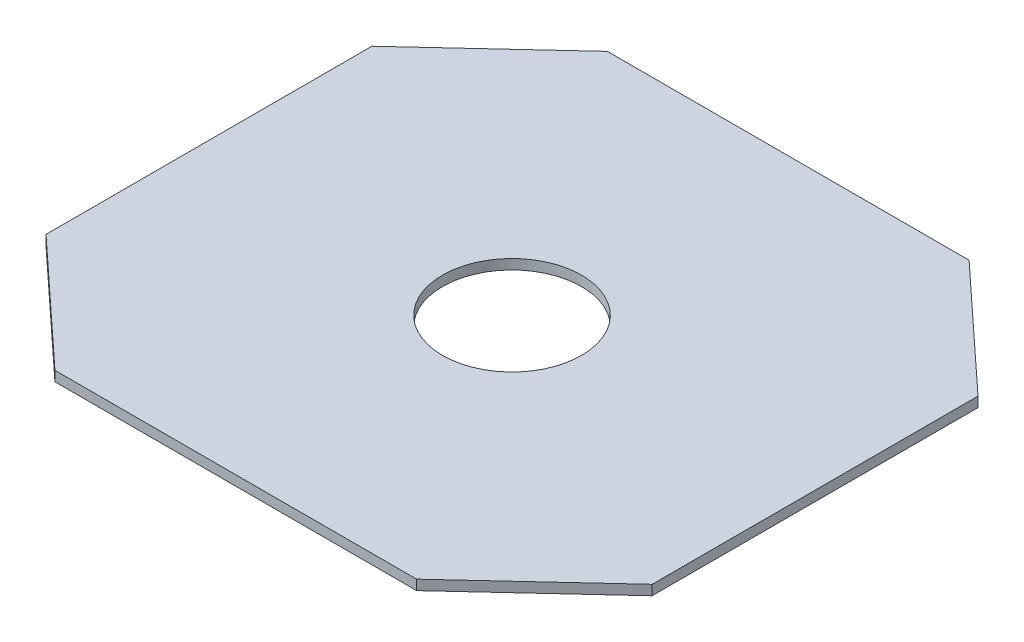
ISO-10303-21;
HEADER;
FILE_DESCRIPTION(('STEP AP214'),'2;1');
FILE_NAME('part.step','',(''),(''),'','','');
FILE_SCHEMA(('AUTOMOTIVE_DESIGN { 1 0 10303 214 1 1 1 1 }'));
ENDSEC;
DATA;
#1=APPLICATION_CONTEXT('core data for automotive mechanical design processes');
#2=APPLICATION_PROTOCOL_DEFINITION('international standard','automotive_design',2000,#1);
#3=PRODUCT_CONTEXT('',#1,'mechanical');
#4=PRODUCT('Part','Part','',(#3));
#5=PRODUCT_RELATED_PRODUCT_CATEGORY('part','',(#4));
#6=PRODUCT_DEFINITION_FORMATION('','',#4);
#7=PRODUCT_DEFINITION_CONTEXT('part definition',#1,'design');
#8=PRODUCT_DEFINITION('design','',#6,#7);
#9=PRODUCT_DEFINITION_SHAPE('','',#8);
#10=(LENGTH_UNIT() NAMED_UNIT(*) SI_UNIT(.MILLI.,.METRE.));
#11=(NAMED_UNIT(*) PLANE_ANGLE_UNIT() SI_UNIT($,.RADIAN.));
#12=(NAMED_UNIT(*) SI_UNIT($,.STERADIAN.) SOLID_ANGLE_UNIT());
#13=UNCERTAINTY_MEASURE_WITH_UNIT(LENGTH_MEASURE(1.E-05),#10,'distance_accuracy_value','');
#14=(GEOMETRIC_REPRESENTATION_CONTEXT(3) GLOBAL_UNCERTAINTY_ASSIGNED_CONTEXT((#13)) GLOBAL_UNIT_ASSIGNED_CONTEXT((#10,
#11,#12)) REPRESENTATION_CONTEXT('',''));
#15=CARTESIAN_POINT('',(0.,0.,0.));
#16=DIRECTION('',(0.,0.,1.));
#17=DIRECTION('',(1.,0.,0.));
#18=AXIS2_PLACEMENT_3D('',#15,#16,#17);
#19=CARTESIAN_POINT('',(0.80694849794305,5.,-219.257942140658));
#20=DIRECTION('',(0.,-1.,0.));
#21=DIRECTION('',(0.,0.,-1.));
#22=AXIS2_PLACEMENT_3D('',#19,#20,#21);
#23=PLANE('',#22);
#24=DIRECTION('',(-0.733430296619931,0.,-0.679764665159936));
#25=VECTOR('',#24,1.);
#26=CARTESIAN_POINT('',(153.306948497943,5.,-77.916478726024));
#27=LINE('',#26,#25);
#28=CARTESIAN_POINT('',(153.306948497943,5.,-77.916478726024));
#29=VERTEX_POINT('',#28);
#30=CARTESIAN_POINT('',(91.8069484979431,5.,-134.916478726024));
#31=VERTEX_POINT('',#30);
#32=EDGE_CURVE('E143',#29,#31,#27,.T.);
#33=ORIENTED_EDGE('',*,*,#32,.T.);
#34=DIRECTION('',(-1.,0.,0.));
#35=VECTOR('',#34,1.);
#36=CARTESIAN_POINT('',(-90.1930515020569,5.,-134.916478726024));
#37=LINE('',#36,#35);
#38=CARTESIAN_POINT('',(-90.1930515020569,5.,-134.916478726024));
#39=VERTEX_POINT('',#38);
#40=EDGE_CURVE('E91',#31,#39,#37,.T.);
#41=ORIENTED_EDGE('',*,*,#40,.T.);
#42=DIRECTION('',(-0.733430296619931,0.,0.679764665159936));
#43=VECTOR('',#42,1.);
#44=CARTESIAN_POINT('',(-151.693051502057,5.,-77.916478726024));
#45=LINE('',#44,#43);
#46=CARTESIAN_POINT('',(-151.693051502057,5.,-77.916478726024));
#47=VERTEX_POINT('',#46);
#48=EDGE_CURVE('E158',#39,#47,#45,.T.);
#49=ORIENTED_EDGE('',*,*,#48,.T.);
#50=DIRECTION('',(0.,0.,1.));
#51=VECTOR('',#50,1.);
#52=CARTESIAN_POINT('',(-151.693051502057,5.,-77.916478726024));
#53=LINE('',#52,#51);
#54=CARTESIAN_POINT('',(-151.693051502057,5.,86.0835212739761));
#55=VERTEX_POINT('',#54);
#56=EDGE_CURVE('E171',#47,#55,#53,.T.);
#57=ORIENTED_EDGE('',*,*,#56,.T.);
#58=DIRECTION('',(0.733430296619931,0.,0.679764665159936));
#59=VECTOR('',#58,1.);
#60=CARTESIAN_POINT('',(-151.693051502057,5.,86.0835212739761));
#61=LINE('',#60,#59);
#62=CARTESIAN_POINT('',(-90.1930515020569,5.,143.083521273976));
#63=VERTEX_POINT('',#62);
#64=EDGE_CURVE('E110',#55,#63,#61,.T.);
#65=ORIENTED_EDGE('',*,*,#64,.T.);
#66=DIRECTION('',(1.,0.,0.));
#67=VECTOR('',#66,1.);
#68=CARTESIAN_POINT('',(-90.1930515020569,5.,143.083521273976));
#69=LINE('',#68,#67);
#70=CARTESIAN_POINT('',(91.8069484979431,5.,143.083521273976));
#71=VERTEX_POINT('',#70);
#72=EDGE_CURVE('E104',#63,#71,#69,.T.);
#73=ORIENTED_EDGE('',*,*,#72,.T.);
#74=DIRECTION('',(0.733430296619931,0.,-0.679764665159936));
#75=VECTOR('',#74,1.);
#76=CARTESIAN_POINT('',(153.306948497943,5.,86.0835212739761));
#77=LINE('',#76,#75);
#78=CARTESIAN_POINT('',(153.306948497943,5.,86.0835212739761));
#79=VERTEX_POINT('',#78);
#80=EDGE_CURVE('E108',#71,#79,#77,.T.);
#81=ORIENTED_EDGE('',*,*,#80,.T.);
#82=DIRECTION('',(0.,0.,-1.));
#83=VECTOR('',#82,1.);
#84=CARTESIAN_POINT('',(153.306948497943,5.,-77.916478726024));
#85=LINE('',#84,#83);
#86=EDGE_CURVE('E48',#79,#29,#85,.T.);
#87=ORIENTED_EDGE('',*,*,#86,.T.);
#88=EDGE_LOOP('',(#33,#41,#49,#57,#65,#73,#81,#87));
#89=FACE_BOUND('',#88,.T.);
#90=CARTESIAN_POINT('',(0.806948497943091,5.,4.08352127397604));
#91=DIRECTION('',(0.,1.,0.));
#92=DIRECTION('',(0.,0.,1.));
#93=AXIS2_PLACEMENT_3D('',#90,#91,#92);
#94=CIRCLE('',#93,34.9999999999989);
#95=CARTESIAN_POINT('',(0.806948497943091,5.,39.0835212739749));
#96=VERTEX_POINT('',#95);
#97=EDGE_CURVE('E132',#96,#96,#94,.T.);
#98=ORIENTED_EDGE('',*,*,#97,.F.);
#99=EDGE_LOOP('',(#98));
#100=FACE_BOUND('',#99,.T.);
#101=ADVANCED_FACE('F31',(#89,#100),#23,.F.);
#102=CARTESIAN_POINT('',(0.80694849794305,0.,-219.257942140658));
#103=DIRECTION('',(0.,-1.,0.));
#104=DIRECTION('',(0.,0.,-1.));
#105=AXIS2_PLACEMENT_3D('',#102,#103,#104);
#106=PLANE('',#105);
#107=DIRECTION('',(-0.733430296619931,0.,-0.679764665159936));
#108=VECTOR('',#107,1.);
#109=CARTESIAN_POINT('',(153.306948497943,0.,-77.916478726024));
#110=LINE('',#109,#108);
#111=CARTESIAN_POINT('',(153.306948497943,0.,-77.916478726024));
#112=VERTEX_POINT('',#111);
#113=CARTESIAN_POINT('',(91.8069484979431,0.,-134.916478726024));
#114=VERTEX_POINT('',#113);
#115=EDGE_CURVE('E128',#112,#114,#110,.T.);
#116=ORIENTED_EDGE('',*,*,#115,.F.);
#117=DIRECTION('',(0.,0.,-1.));
#118=VECTOR('',#117,1.);
#119=CARTESIAN_POINT('',(153.306948497943,0.,-77.916478726024));
#120=LINE('',#119,#118);
#121=CARTESIAN_POINT('',(153.306948497943,0.,86.0835212739761));
#122=VERTEX_POINT('',#121);
#123=EDGE_CURVE('E83',#122,#112,#120,.T.);
#124=ORIENTED_EDGE('',*,*,#123,.F.);
#125=DIRECTION('',(0.733430296619931,0.,-0.679764665159936));
#126=VECTOR('',#125,1.);
#127=CARTESIAN_POINT('',(153.306948497943,0.,86.0835212739761));
#128=LINE('',#127,#126);
#129=CARTESIAN_POINT('',(91.8069484979431,0.,143.083521273976));
#130=VERTEX_POINT('',#129);
#131=EDGE_CURVE('E77',#130,#122,#128,.T.);
#132=ORIENTED_EDGE('',*,*,#131,.F.);
#133=DIRECTION('',(1.,0.,0.));
#134=VECTOR('',#133,1.);
#135=CARTESIAN_POINT('',(-90.1930515020569,0.,143.083521273976));
#136=LINE('',#135,#134);
#137=CARTESIAN_POINT('',(-90.1930515020569,0.,143.083521273976));
#138=VERTEX_POINT('',#137);
#139=EDGE_CURVE('E118',#138,#130,#136,.T.);
#140=ORIENTED_EDGE('',*,*,#139,.F.);
#141=DIRECTION('',(0.733430296619931,0.,0.679764665159936));
#142=VECTOR('',#141,1.);
#143=CARTESIAN_POINT('',(-151.693051502057,0.,86.0835212739761));
#144=LINE('',#143,#142);
#145=CARTESIAN_POINT('',(-151.693051502057,0.,86.0835212739761));
#146=VERTEX_POINT('',#145);
#147=EDGE_CURVE('E138',#146,#138,#144,.T.);
#148=ORIENTED_EDGE('',*,*,#147,.F.);
#149=DIRECTION('',(0.,0.,1.));
#150=VECTOR('',#149,1.);
#151=CARTESIAN_POINT('',(-151.693051502057,0.,-77.916478726024));
#152=LINE('',#151,#150);
#153=CARTESIAN_POINT('',(-151.693051502057,0.,-77.916478726024));
#154=VERTEX_POINT('',#153);
#155=EDGE_CURVE('E136',#154,#146,#152,.T.);
#156=ORIENTED_EDGE('',*,*,#155,.F.);
#157=DIRECTION('',(-0.733430296619931,0.,0.679764665159936));
#158=VECTOR('',#157,1.);
#159=CARTESIAN_POINT('',(-151.693051502057,0.,-77.916478726024));
#160=LINE('',#159,#158);
#161=CARTESIAN_POINT('',(-90.1930515020569,0.,-134.916478726024));
#162=VERTEX_POINT('',#161);
#163=EDGE_CURVE('E134',#162,#154,#160,.T.);
#164=ORIENTED_EDGE('',*,*,#163,.F.);
#165=DIRECTION('',(-1.,0.,0.));
#166=VECTOR('',#165,1.);
#167=CARTESIAN_POINT('',(-90.1930515020569,0.,-134.916478726024));
#168=LINE('',#167,#166);
#169=EDGE_CURVE('E131',#114,#162,#168,.T.);
#170=ORIENTED_EDGE('',*,*,#169,.F.);
#171=EDGE_LOOP('',(#116,#124,#132,#140,#148,#156,#164,#170));
#172=FACE_BOUND('',#171,.T.);
#173=CARTESIAN_POINT('',(0.806948497943091,0.,4.08352127397604));
#174=DIRECTION('',(0.,1.,0.));
#175=DIRECTION('',(0.,0.,1.));
#176=AXIS2_PLACEMENT_3D('',#173,#174,#175);
#177=CIRCLE('',#176,34.9999999999989);
#178=CARTESIAN_POINT('',(0.806948497943091,0.,39.0835212739749));
#179=VERTEX_POINT('',#178);
#180=EDGE_CURVE('E177',#179,#179,#177,.T.);
#181=ORIENTED_EDGE('',*,*,#180,.T.);
#182=EDGE_LOOP('',(#181));
#183=FACE_BOUND('',#182,.T.);
#184=ADVANCED_FACE('F162',(#172,#183),#106,.T.);
#185=CARTESIAN_POINT('',(153.306948497943,5.,-77.916478726024));
#186=DIRECTION('',(-0.679764665159936,0.,0.733430296619931));
#187=DIRECTION('',(0.733430296619931,0.,0.679764665159936));
#188=AXIS2_PLACEMENT_3D('',#185,#186,#187);
#189=PLANE('',#188);
#190=ORIENTED_EDGE('',*,*,#115,.T.);
#191=DIRECTION('',(0.,-1.,0.));
#192=VECTOR('',#191,1.);
#193=CARTESIAN_POINT('',(91.8069484979431,5.,-134.916478726024));
#194=LINE('',#193,#192);
#195=EDGE_CURVE('E11',#31,#114,#194,.T.);
#196=ORIENTED_EDGE('',*,*,#195,.F.);
#197=ORIENTED_EDGE('',*,*,#32,.F.);
#198=DIRECTION('',(0.,-1.,0.));
#199=VECTOR('',#198,1.);
#200=CARTESIAN_POINT('',(153.306948497943,5.,-77.916478726024));
#201=LINE('',#200,#199);
#202=EDGE_CURVE('E124',#29,#112,#201,.T.);
#203=ORIENTED_EDGE('',*,*,#202,.T.);
#204=EDGE_LOOP('',(#190,#196,#197,#203));
#205=FACE_BOUND('',#204,.T.);
#206=ADVANCED_FACE('F33',(#205),#189,.F.);
#207=CARTESIAN_POINT('',(-90.1930515020569,5.,-134.916478726024));
#208=DIRECTION('',(0.,0.,1.));
#209=DIRECTION('',(1.,0.,0.));
#210=AXIS2_PLACEMENT_3D('',#207,#208,#209);
#211=PLANE('',#210);
#212=ORIENTED_EDGE('',*,*,#169,.T.);
#213=DIRECTION('',(0.,-1.,0.));
#214=VECTOR('',#213,1.);
#215=CARTESIAN_POINT('',(-90.1930515020569,5.,-134.916478726024));
#216=LINE('',#215,#214);
#217=EDGE_CURVE('E40',#39,#162,#216,.T.);
#218=ORIENTED_EDGE('',*,*,#217,.F.);
#219=ORIENTED_EDGE('',*,*,#40,.F.);
#220=ORIENTED_EDGE('',*,*,#195,.T.);
#221=EDGE_LOOP('',(#212,#218,#219,#220));
#222=FACE_BOUND('',#221,.T.);
#223=ADVANCED_FACE('F205',(#222),#211,.F.);
#224=CARTESIAN_POINT('',(-151.693051502057,5.,-77.916478726024));
#225=DIRECTION('',(0.679764665159936,0.,0.733430296619931));
#226=DIRECTION('',(0.733430296619931,0.,-0.679764665159936));
#227=AXIS2_PLACEMENT_3D('',#224,#225,#226);
#228=PLANE('',#227);
#229=ORIENTED_EDGE('',*,*,#163,.T.);
#230=DIRECTION('',(0.,-1.,0.));
#231=VECTOR('',#230,1.);
#232=CARTESIAN_POINT('',(-151.693051502057,5.,-77.916478726024));
#233=LINE('',#232,#231);
#234=EDGE_CURVE('E150',#47,#154,#233,.T.);
#235=ORIENTED_EDGE('',*,*,#234,.F.);
#236=ORIENTED_EDGE('',*,*,#48,.F.);
#237=ORIENTED_EDGE('',*,*,#217,.T.);
#238=EDGE_LOOP('',(#229,#235,#236,#237));
#239=FACE_BOUND('',#238,.T.);
#240=ADVANCED_FACE('F156',(#239),#228,.F.);
#241=CARTESIAN_POINT('',(-151.693051502057,5.,-77.916478726024));
#242=DIRECTION('',(1.,0.,0.));
#243=DIRECTION('',(0.,0.,-1.));
#244=AXIS2_PLACEMENT_3D('',#241,#242,#243);
#245=PLANE('',#244);
#246=ORIENTED_EDGE('',*,*,#155,.T.);
#247=DIRECTION('',(0.,-1.,0.));
#248=VECTOR('',#247,1.);
#249=CARTESIAN_POINT('',(-151.693051502057,5.,86.0835212739761));
#250=LINE('',#249,#248);
#251=EDGE_CURVE('E147',#55,#146,#250,.T.);
#252=ORIENTED_EDGE('',*,*,#251,.F.);
#253=ORIENTED_EDGE('',*,*,#56,.F.);
#254=ORIENTED_EDGE('',*,*,#234,.T.);
#255=EDGE_LOOP('',(#246,#252,#253,#254));
#256=FACE_BOUND('',#255,.T.);
#257=ADVANCED_FACE('F167',(#256),#245,.F.);
#258=CARTESIAN_POINT('',(-151.693051502057,5.,86.0835212739761));
#259=DIRECTION('',(0.679764665159936,0.,-0.733430296619931));
#260=DIRECTION('',(-0.733430296619931,0.,-0.679764665159936));
#261=AXIS2_PLACEMENT_3D('',#258,#259,#260);
#262=PLANE('',#261);
#263=ORIENTED_EDGE('',*,*,#147,.T.);
#264=DIRECTION('',(0.,-1.,0.));
#265=VECTOR('',#264,1.);
#266=CARTESIAN_POINT('',(-90.1930515020569,5.,143.083521273976));
#267=LINE('',#266,#265);
#268=EDGE_CURVE('E119',#63,#138,#267,.T.);
#269=ORIENTED_EDGE('',*,*,#268,.F.);
#270=ORIENTED_EDGE('',*,*,#64,.F.);
#271=ORIENTED_EDGE('',*,*,#251,.T.);
#272=EDGE_LOOP('',(#263,#269,#270,#271));
#273=FACE_BOUND('',#272,.T.);
#274=ADVANCED_FACE('F170',(#273),#262,.F.);
#275=CARTESIAN_POINT('',(-90.1930515020569,5.,143.083521273976));
#276=DIRECTION('',(0.,0.,-1.));
#277=DIRECTION('',(-1.,0.,0.));
#278=AXIS2_PLACEMENT_3D('',#275,#276,#277);
#279=PLANE('',#278);
#280=ORIENTED_EDGE('',*,*,#139,.T.);
#281=DIRECTION('',(0.,-1.,0.));
#282=VECTOR('',#281,1.);
#283=CARTESIAN_POINT('',(91.8069484979431,5.,143.083521273976));
#284=LINE('',#283,#282);
#285=EDGE_CURVE('E115',#71,#130,#284,.T.);
#286=ORIENTED_EDGE('',*,*,#285,.F.);
#287=ORIENTED_EDGE('',*,*,#72,.F.);
#288=ORIENTED_EDGE('',*,*,#268,.T.);
#289=EDGE_LOOP('',(#280,#286,#287,#288));
#290=FACE_BOUND('',#289,.T.);
#291=ADVANCED_FACE('F116',(#290),#279,.F.);
#292=CARTESIAN_POINT('',(153.306948497943,5.,86.0835212739761));
#293=DIRECTION('',(-0.679764665159936,0.,-0.733430296619931));
#294=DIRECTION('',(-0.733430296619931,0.,0.679764665159936));
#295=AXIS2_PLACEMENT_3D('',#292,#293,#294);
#296=PLANE('',#295);
#297=ORIENTED_EDGE('',*,*,#131,.T.);
#298=DIRECTION('',(0.,-1.,0.));
#299=VECTOR('',#298,1.);
#300=CARTESIAN_POINT('',(153.306948497943,5.,86.0835212739761));
#301=LINE('',#300,#299);
#302=EDGE_CURVE('E120',#79,#122,#301,.T.);
#303=ORIENTED_EDGE('',*,*,#302,.F.);
#304=ORIENTED_EDGE('',*,*,#80,.F.);
#305=ORIENTED_EDGE('',*,*,#285,.T.);
#306=EDGE_LOOP('',(#297,#303,#304,#305));
#307=FACE_BOUND('',#306,.T.);
#308=ADVANCED_FACE('F122',(#307),#296,.F.);
#309=CARTESIAN_POINT('',(153.306948497943,5.,-77.916478726024));
#310=DIRECTION('',(-1.,0.,0.));
#311=DIRECTION('',(0.,0.,1.));
#312=AXIS2_PLACEMENT_3D('',#309,#310,#311);
#313=PLANE('',#312);
#314=ORIENTED_EDGE('',*,*,#123,.T.);
#315=ORIENTED_EDGE('',*,*,#202,.F.);
#316=ORIENTED_EDGE('',*,*,#86,.F.);
#317=ORIENTED_EDGE('',*,*,#302,.T.);
#318=EDGE_LOOP('',(#314,#315,#316,#317));
#319=FACE_BOUND('',#318,.T.);
#320=ADVANCED_FACE('F193',(#319),#313,.F.);
#321=CARTESIAN_POINT('',(0.806948497943091,5.,4.08352127397604));
#322=DIRECTION('',(0.,-1.,0.));
#323=DIRECTION('',(0.,0.,-1.));
#324=AXIS2_PLACEMENT_3D('',#321,#322,#323);
#325=CYLINDRICAL_SURFACE('',#324,34.9999999999989);
#326=ORIENTED_EDGE('',*,*,#97,.T.);
#327=EDGE_LOOP('',(#326));
#328=FACE_BOUND('',#327,.T.);
#329=ORIENTED_EDGE('',*,*,#180,.F.);
#330=EDGE_LOOP('',(#329));
#331=FACE_BOUND('',#330,.T.);
#332=ADVANCED_FACE('F183',(#328,#331),#325,.F.);
#333=CLOSED_SHELL('',(#101,#184,#206,#223,#240,#257,#274,#291,#308,#320,#332));
#334=MANIFOLD_SOLID_BREP('B2',#333);
#335=ADVANCED_BREP_SHAPE_REPRESENTATION('',(#18,#334),#14);
#336=SHAPE_DEFINITION_REPRESENTATION(#9,#335);
ENDSEC;
END-ISO-10303-21;
